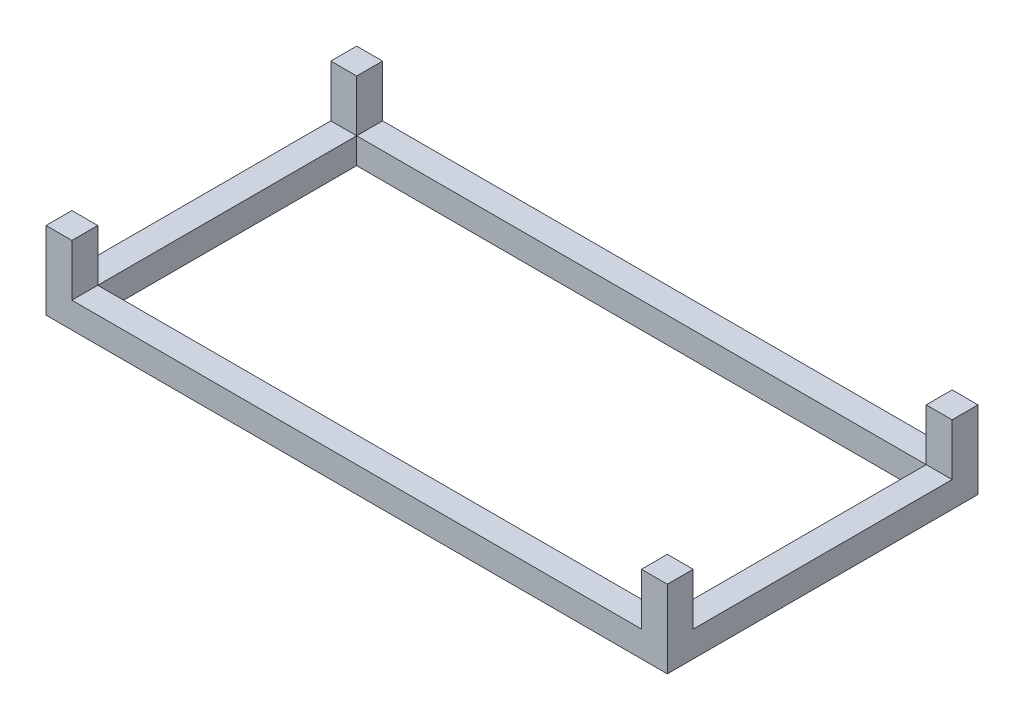
ISO-10303-21;
HEADER;
FILE_DESCRIPTION(('STEP AP214'),'2;1');
FILE_NAME('part.step','',(''),(''),'','','');
FILE_SCHEMA(('AUTOMOTIVE_DESIGN { 1 0 10303 214 1 1 1 1 }'));
ENDSEC;
DATA;
#1=APPLICATION_CONTEXT('core data for automotive mechanical design processes');
#2=APPLICATION_PROTOCOL_DEFINITION('international standard','automotive_design',2000,#1);
#3=PRODUCT_CONTEXT('',#1,'mechanical');
#4=PRODUCT('Part','Part','',(#3));
#5=PRODUCT_RELATED_PRODUCT_CATEGORY('part','',(#4));
#6=PRODUCT_DEFINITION_FORMATION('','',#4);
#7=PRODUCT_DEFINITION_CONTEXT('part definition',#1,'design');
#8=PRODUCT_DEFINITION('design','',#6,#7);
#9=PRODUCT_DEFINITION_SHAPE('','',#8);
#10=(LENGTH_UNIT() NAMED_UNIT(*) SI_UNIT(.MILLI.,.METRE.));
#11=(NAMED_UNIT(*) PLANE_ANGLE_UNIT() SI_UNIT($,.RADIAN.));
#12=(NAMED_UNIT(*) SI_UNIT($,.STERADIAN.) SOLID_ANGLE_UNIT());
#13=UNCERTAINTY_MEASURE_WITH_UNIT(LENGTH_MEASURE(1.E-05),#10,'distance_accuracy_value','');
#14=(GEOMETRIC_REPRESENTATION_CONTEXT(3) GLOBAL_UNCERTAINTY_ASSIGNED_CONTEXT((#13)) GLOBAL_UNIT_ASSIGNED_CONTEXT((#10,
#11,#12)) REPRESENTATION_CONTEXT('',''));
#15=CARTESIAN_POINT('',(0.,0.,0.));
#16=DIRECTION('',(0.,0.,1.));
#17=DIRECTION('',(1.,0.,0.));
#18=AXIS2_PLACEMENT_3D('',#15,#16,#17);
#19=CARTESIAN_POINT('',(0.,0.,0.));
#20=DIRECTION('',(0.,1.,0.));
#21=DIRECTION('',(0.,0.,1.));
#22=AXIS2_PLACEMENT_3D('',#19,#20,#21);
#23=PLANE('',#22);
#24=DIRECTION('',(1.,0.,0.));
#25=VECTOR('',#24,1.);
#26=CARTESIAN_POINT('',(-69.85,0.,-31.75));
#27=LINE('',#26,#25);
#28=CARTESIAN_POINT('',(-69.85,0.,-31.75));
#29=VERTEX_POINT('',#28);
#30=CARTESIAN_POINT('',(69.85,0.,-31.75));
#31=VERTEX_POINT('',#30);
#32=EDGE_CURVE('E266',#29,#31,#27,.T.);
#33=ORIENTED_EDGE('',*,*,#32,.T.);
#34=DIRECTION('',(0.,0.,1.));
#35=VECTOR('',#34,1.);
#36=CARTESIAN_POINT('',(69.85,0.,-31.75));
#37=LINE('',#36,#35);
#38=CARTESIAN_POINT('',(69.85,0.,-38.1));
#39=VERTEX_POINT('',#38);
#40=EDGE_CURVE('E50',#39,#31,#37,.T.);
#41=ORIENTED_EDGE('',*,*,#40,.F.);
#42=DIRECTION('',(-1.,0.,0.));
#43=VECTOR('',#42,1.);
#44=CARTESIAN_POINT('',(-76.2,0.,-38.1));
#45=LINE('',#44,#43);
#46=CARTESIAN_POINT('',(-69.85,0.,-38.1));
#47=VERTEX_POINT('',#46);
#48=EDGE_CURVE('E298',#39,#47,#45,.T.);
#49=ORIENTED_EDGE('',*,*,#48,.T.);
#50=DIRECTION('',(0.,0.,-1.));
#51=VECTOR('',#50,1.);
#52=CARTESIAN_POINT('',(-69.85,0.,-38.1));
#53=LINE('',#52,#51);
#54=EDGE_CURVE('E243',#29,#47,#53,.T.);
#55=ORIENTED_EDGE('',*,*,#54,.F.);
#56=EDGE_LOOP('',(#33,#41,#49,#55));
#57=FACE_BOUND('',#56,.T.);
#58=ADVANCED_FACE('F33',(#57),#23,.T.);
#59=DIRECTION('',(0.,0.,-1.));
#60=VECTOR('',#59,1.);
#61=CARTESIAN_POINT('',(76.2,0.,-38.1));
#62=LINE('',#61,#60);
#63=CARTESIAN_POINT('',(76.2,0.,31.75));
#64=VERTEX_POINT('',#63);
#65=CARTESIAN_POINT('',(76.2,0.,-31.75));
#66=VERTEX_POINT('',#65);
#67=EDGE_CURVE('E58',#64,#66,#62,.T.);
#68=ORIENTED_EDGE('',*,*,#67,.T.);
#69=DIRECTION('',(1.,0.,0.));
#70=VECTOR('',#69,1.);
#71=CARTESIAN_POINT('',(69.85,0.,-31.75));
#72=LINE('',#71,#70);
#73=EDGE_CURVE('E180',#31,#66,#72,.T.);
#74=ORIENTED_EDGE('',*,*,#73,.F.);
#75=DIRECTION('',(0.,0.,1.));
#76=VECTOR('',#75,1.);
#77=CARTESIAN_POINT('',(69.85,0.,31.75));
#78=LINE('',#77,#76);
#79=CARTESIAN_POINT('',(69.85,0.,31.75));
#80=VERTEX_POINT('',#79);
#81=EDGE_CURVE('E269',#31,#80,#78,.T.);
#82=ORIENTED_EDGE('',*,*,#81,.T.);
#83=DIRECTION('',(-1.,0.,0.));
#84=VECTOR('',#83,1.);
#85=CARTESIAN_POINT('',(69.85,0.,31.75));
#86=LINE('',#85,#84);
#87=EDGE_CURVE('E186',#64,#80,#86,.T.);
#88=ORIENTED_EDGE('',*,*,#87,.F.);
#89=EDGE_LOOP('',(#68,#74,#82,#88));
#90=FACE_BOUND('',#89,.T.);
#91=ADVANCED_FACE('F374',(#90),#23,.T.);
#92=DIRECTION('',(1.,0.,0.));
#93=VECTOR('',#92,1.);
#94=CARTESIAN_POINT('',(-76.2,0.,38.1));
#95=LINE('',#94,#93);
#96=CARTESIAN_POINT('',(-69.85,0.,38.1));
#97=VERTEX_POINT('',#96);
#98=CARTESIAN_POINT('',(69.8499999999999,0.,38.1));
#99=VERTEX_POINT('',#98);
#100=EDGE_CURVE('E308',#97,#99,#95,.T.);
#101=ORIENTED_EDGE('',*,*,#100,.T.);
#102=DIRECTION('',(0.,0.,1.));
#103=VECTOR('',#102,1.);
#104=CARTESIAN_POINT('',(69.85,0.,31.75));
#105=LINE('',#104,#103);
#106=EDGE_CURVE('E183',#80,#99,#105,.T.);
#107=ORIENTED_EDGE('',*,*,#106,.F.);
#108=DIRECTION('',(-1.,0.,0.));
#109=VECTOR('',#108,1.);
#110=CARTESIAN_POINT('',(-69.85,0.,31.75));
#111=LINE('',#110,#109);
#112=CARTESIAN_POINT('',(-69.85,0.,31.75));
#113=VERTEX_POINT('',#112);
#114=EDGE_CURVE('E272',#80,#113,#111,.T.);
#115=ORIENTED_EDGE('',*,*,#114,.T.);
#116=DIRECTION('',(0.,0.,-1.));
#117=VECTOR('',#116,1.);
#118=CARTESIAN_POINT('',(-69.85,0.,31.75));
#119=LINE('',#118,#117);
#120=EDGE_CURVE('E213',#97,#113,#119,.T.);
#121=ORIENTED_EDGE('',*,*,#120,.F.);
#122=EDGE_LOOP('',(#101,#107,#115,#121));
#123=FACE_BOUND('',#122,.T.);
#124=ADVANCED_FACE('F362',(#123),#23,.T.);
#125=DIRECTION('',(0.,0.,1.));
#126=VECTOR('',#125,1.);
#127=CARTESIAN_POINT('',(-76.2,0.,-38.1));
#128=LINE('',#127,#126);
#129=CARTESIAN_POINT('',(-76.2,0.,-31.75));
#130=VERTEX_POINT('',#129);
#131=CARTESIAN_POINT('',(-76.2,0.,31.75));
#132=VERTEX_POINT('',#131);
#133=EDGE_CURVE('E287',#130,#132,#128,.T.);
#134=ORIENTED_EDGE('',*,*,#133,.T.);
#135=DIRECTION('',(-1.,0.,0.));
#136=VECTOR('',#135,1.);
#137=CARTESIAN_POINT('',(-69.85,0.,31.75));
#138=LINE('',#137,#136);
#139=EDGE_CURVE('E218',#113,#132,#138,.T.);
#140=ORIENTED_EDGE('',*,*,#139,.F.);
#141=DIRECTION('',(0.,0.,-1.));
#142=VECTOR('',#141,1.);
#143=CARTESIAN_POINT('',(-69.85,0.,31.75));
#144=LINE('',#143,#142);
#145=EDGE_CURVE('E264',#113,#29,#144,.T.);
#146=ORIENTED_EDGE('',*,*,#145,.T.);
#147=DIRECTION('',(1.,0.,0.));
#148=VECTOR('',#147,1.);
#149=CARTESIAN_POINT('',(-76.2,0.,-31.75));
#150=LINE('',#149,#148);
#151=EDGE_CURVE('E238',#130,#29,#150,.T.);
#152=ORIENTED_EDGE('',*,*,#151,.F.);
#153=EDGE_LOOP('',(#134,#140,#146,#152));
#154=FACE_BOUND('',#153,.T.);
#155=ADVANCED_FACE('F390',(#154),#23,.T.);
#156=CARTESIAN_POINT('',(-76.2,-6.35,-38.1));
#157=DIRECTION('',(-1.,0.,0.));
#158=DIRECTION('',(0.,0.,1.));
#159=AXIS2_PLACEMENT_3D('',#156,#157,#158);
#160=PLANE('',#159);
#161=ORIENTED_EDGE('',*,*,#133,.F.);
#162=DIRECTION('',(0.,-1.,0.));
#163=VECTOR('',#162,1.);
#164=CARTESIAN_POINT('',(-76.2,12.7,-31.75));
#165=LINE('',#164,#163);
#166=CARTESIAN_POINT('',(-76.2,12.7,-31.75));
#167=VERTEX_POINT('',#166);
#168=EDGE_CURVE('E260',#167,#130,#165,.T.);
#169=ORIENTED_EDGE('',*,*,#168,.F.);
#170=DIRECTION('',(0.,0.,1.));
#171=VECTOR('',#170,1.);
#172=CARTESIAN_POINT('',(-76.2,12.7,-38.1));
#173=LINE('',#172,#171);
#174=CARTESIAN_POINT('',(-76.2,12.7,-38.1));
#175=VERTEX_POINT('',#174);
#176=EDGE_CURVE('E239',#175,#167,#173,.T.);
#177=ORIENTED_EDGE('',*,*,#176,.F.);
#178=DIRECTION('',(0.,1.,0.));
#179=VECTOR('',#178,1.);
#180=CARTESIAN_POINT('',(-76.2,-6.35,-38.1));
#181=LINE('',#180,#179);
#182=CARTESIAN_POINT('',(-76.2,-6.35,-38.1));
#183=VERTEX_POINT('',#182);
#184=EDGE_CURVE('E11',#183,#175,#181,.T.);
#185=ORIENTED_EDGE('',*,*,#184,.F.);
#186=DIRECTION('',(0.,0.,1.));
#187=VECTOR('',#186,1.);
#188=CARTESIAN_POINT('',(-76.2,-6.35,-38.1));
#189=LINE('',#188,#187);
#190=CARTESIAN_POINT('',(-76.2,-6.35,38.1));
#191=VERTEX_POINT('',#190);
#192=EDGE_CURVE('E294',#183,#191,#189,.T.);
#193=ORIENTED_EDGE('',*,*,#192,.T.);
#194=DIRECTION('',(0.,1.,0.));
#195=VECTOR('',#194,1.);
#196=CARTESIAN_POINT('',(-76.2,-6.35,38.1));
#197=LINE('',#196,#195);
#198=CARTESIAN_POINT('',(-76.2,12.7,38.1));
#199=VERTEX_POINT('',#198);
#200=EDGE_CURVE('E37',#191,#199,#197,.T.);
#201=ORIENTED_EDGE('',*,*,#200,.T.);
#202=DIRECTION('',(0.,0.,1.));
#203=VECTOR('',#202,1.);
#204=CARTESIAN_POINT('',(-76.2,12.7,31.75));
#205=LINE('',#204,#203);
#206=CARTESIAN_POINT('',(-76.2,12.7,31.75));
#207=VERTEX_POINT('',#206);
#208=EDGE_CURVE('E220',#207,#199,#205,.T.);
#209=ORIENTED_EDGE('',*,*,#208,.F.);
#210=DIRECTION('',(0.,-1.,0.));
#211=VECTOR('',#210,1.);
#212=CARTESIAN_POINT('',(-76.2,12.7,31.75));
#213=LINE('',#212,#211);
#214=EDGE_CURVE('E232',#207,#132,#213,.T.);
#215=ORIENTED_EDGE('',*,*,#214,.T.);
#216=EDGE_LOOP('',(#161,#169,#177,#185,#193,#201,#209,#215));
#217=FACE_BOUND('',#216,.T.);
#218=ADVANCED_FACE('F35',(#217),#160,.T.);
#219=CARTESIAN_POINT('',(-76.2,-6.35,-38.1));
#220=DIRECTION('',(0.,0.,-1.));
#221=DIRECTION('',(-1.,0.,0.));
#222=AXIS2_PLACEMENT_3D('',#219,#220,#221);
#223=PLANE('',#222);
#224=ORIENTED_EDGE('',*,*,#48,.F.);
#225=DIRECTION('',(0.,-1.,0.));
#226=VECTOR('',#225,1.);
#227=CARTESIAN_POINT('',(69.85,12.7,-38.1));
#228=LINE('',#227,#226);
#229=CARTESIAN_POINT('',(69.85,12.7,-38.1));
#230=VERTEX_POINT('',#229);
#231=EDGE_CURVE('E188',#230,#39,#228,.T.);
#232=ORIENTED_EDGE('',*,*,#231,.F.);
#233=DIRECTION('',(-1.,0.,0.));
#234=VECTOR('',#233,1.);
#235=CARTESIAN_POINT('',(69.85,12.7,-38.1));
#236=LINE('',#235,#234);
#237=CARTESIAN_POINT('',(76.2,12.7,-38.1));
#238=VERTEX_POINT('',#237);
#239=EDGE_CURVE('E176',#238,#230,#236,.T.);
#240=ORIENTED_EDGE('',*,*,#239,.F.);
#241=DIRECTION('',(0.,1.,0.));
#242=VECTOR('',#241,1.);
#243=CARTESIAN_POINT('',(76.2,-6.35,-38.1));
#244=LINE('',#243,#242);
#245=CARTESIAN_POINT('',(76.2,-6.35,-38.1));
#246=VERTEX_POINT('',#245);
#247=EDGE_CURVE('E42',#246,#238,#244,.T.);
#248=ORIENTED_EDGE('',*,*,#247,.F.);
#249=DIRECTION('',(-1.,0.,0.));
#250=VECTOR('',#249,1.);
#251=CARTESIAN_POINT('',(-76.2,-6.35,-38.1));
#252=LINE('',#251,#250);
#253=EDGE_CURVE('E304',#246,#183,#252,.T.);
#254=ORIENTED_EDGE('',*,*,#253,.T.);
#255=ORIENTED_EDGE('',*,*,#184,.T.);
#256=DIRECTION('',(-1.,0.,0.));
#257=VECTOR('',#256,1.);
#258=CARTESIAN_POINT('',(-76.2,12.7,-38.1));
#259=LINE('',#258,#257);
#260=CARTESIAN_POINT('',(-69.85,12.7,-38.1));
#261=VERTEX_POINT('',#260);
#262=EDGE_CURVE('E247',#261,#175,#259,.T.);
#263=ORIENTED_EDGE('',*,*,#262,.F.);
#264=DIRECTION('',(0.,-1.,0.));
#265=VECTOR('',#264,1.);
#266=CARTESIAN_POINT('',(-69.85,12.7,-38.1));
#267=LINE('',#266,#265);
#268=EDGE_CURVE('E250',#261,#47,#267,.T.);
#269=ORIENTED_EDGE('',*,*,#268,.T.);
#270=EDGE_LOOP('',(#224,#232,#240,#248,#254,#255,#263,#269));
#271=FACE_BOUND('',#270,.T.);
#272=ADVANCED_FACE('F347',(#271),#223,.T.);
#273=CARTESIAN_POINT('',(76.2,-6.35,-38.1));
#274=DIRECTION('',(1.,0.,0.));
#275=DIRECTION('',(0.,0.,-1.));
#276=AXIS2_PLACEMENT_3D('',#273,#274,#275);
#277=PLANE('',#276);
#278=ORIENTED_EDGE('',*,*,#67,.F.);
#279=DIRECTION('',(0.,-1.,0.));
#280=VECTOR('',#279,1.);
#281=CARTESIAN_POINT('',(76.2,12.7,31.75));
#282=LINE('',#281,#280);
#283=CARTESIAN_POINT('',(76.2,12.7,31.75));
#284=VERTEX_POINT('',#283);
#285=EDGE_CURVE('E207',#284,#64,#282,.T.);
#286=ORIENTED_EDGE('',*,*,#285,.F.);
#287=DIRECTION('',(0.,0.,-1.));
#288=VECTOR('',#287,1.);
#289=CARTESIAN_POINT('',(76.2,12.7,31.75));
#290=LINE('',#289,#288);
#291=CARTESIAN_POINT('',(76.2,12.7,38.1));
#292=VERTEX_POINT('',#291);
#293=EDGE_CURVE('E198',#292,#284,#290,.T.);
#294=ORIENTED_EDGE('',*,*,#293,.F.);
#295=DIRECTION('',(0.,1.,0.));
#296=VECTOR('',#295,1.);
#297=CARTESIAN_POINT('',(76.2,-6.35,38.1));
#298=LINE('',#297,#296);
#299=CARTESIAN_POINT('',(76.2,-6.35,38.1));
#300=VERTEX_POINT('',#299);
#301=EDGE_CURVE('E312',#300,#292,#298,.T.);
#302=ORIENTED_EDGE('',*,*,#301,.F.);
#303=DIRECTION('',(0.,0.,-1.));
#304=VECTOR('',#303,1.);
#305=CARTESIAN_POINT('',(76.2,-6.35,-38.1));
#306=LINE('',#305,#304);
#307=EDGE_CURVE('E301',#300,#246,#306,.T.);
#308=ORIENTED_EDGE('',*,*,#307,.T.);
#309=ORIENTED_EDGE('',*,*,#247,.T.);
#310=DIRECTION('',(0.,0.,-1.));
#311=VECTOR('',#310,1.);
#312=CARTESIAN_POINT('',(76.2,12.7,-31.75));
#313=LINE('',#312,#311);
#314=CARTESIAN_POINT('',(76.2,12.7,-31.75));
#315=VERTEX_POINT('',#314);
#316=EDGE_CURVE('E170',#315,#238,#313,.T.);
#317=ORIENTED_EDGE('',*,*,#316,.F.);
#318=DIRECTION('',(0.,-1.,0.));
#319=VECTOR('',#318,1.);
#320=CARTESIAN_POINT('',(76.2,12.7,-31.75));
#321=LINE('',#320,#319);
#322=EDGE_CURVE('E166',#315,#66,#321,.T.);
#323=ORIENTED_EDGE('',*,*,#322,.T.);
#324=EDGE_LOOP('',(#278,#286,#294,#302,#308,#309,#317,#323));
#325=FACE_BOUND('',#324,.T.);
#326=ADVANCED_FACE('F349',(#325),#277,.T.);
#327=CARTESIAN_POINT('',(-76.2,-6.35,38.1));
#328=DIRECTION('',(0.,0.,1.));
#329=DIRECTION('',(1.,0.,0.));
#330=AXIS2_PLACEMENT_3D('',#327,#328,#329);
#331=PLANE('',#330);
#332=ORIENTED_EDGE('',*,*,#100,.F.);
#333=DIRECTION('',(0.,-1.,0.));
#334=VECTOR('',#333,1.);
#335=CARTESIAN_POINT('',(-69.85,12.7,38.1));
#336=LINE('',#335,#334);
#337=CARTESIAN_POINT('',(-69.85,12.7,38.1));
#338=VERTEX_POINT('',#337);
#339=EDGE_CURVE('E225',#338,#97,#336,.T.);
#340=ORIENTED_EDGE('',*,*,#339,.F.);
#341=DIRECTION('',(1.,0.,0.));
#342=VECTOR('',#341,1.);
#343=CARTESIAN_POINT('',(-69.85,12.7,38.1));
#344=LINE('',#343,#342);
#345=EDGE_CURVE('E223',#199,#338,#344,.T.);
#346=ORIENTED_EDGE('',*,*,#345,.F.);
#347=ORIENTED_EDGE('',*,*,#200,.F.);
#348=DIRECTION('',(1.,0.,0.));
#349=VECTOR('',#348,1.);
#350=CARTESIAN_POINT('',(-76.2,-6.35,38.1));
#351=LINE('',#350,#349);
#352=EDGE_CURVE('E297',#191,#300,#351,.T.);
#353=ORIENTED_EDGE('',*,*,#352,.T.);
#354=ORIENTED_EDGE('',*,*,#301,.T.);
#355=DIRECTION('',(1.,0.,0.));
#356=VECTOR('',#355,1.);
#357=CARTESIAN_POINT('',(69.85,12.7,38.1));
#358=LINE('',#357,#356);
#359=CARTESIAN_POINT('',(69.85,12.7,38.1));
#360=VERTEX_POINT('',#359);
#361=EDGE_CURVE('E195',#360,#292,#358,.T.);
#362=ORIENTED_EDGE('',*,*,#361,.F.);
#363=DIRECTION('',(0.,-1.,0.));
#364=VECTOR('',#363,1.);
#365=CARTESIAN_POINT('',(69.85,12.7,38.1));
#366=LINE('',#365,#364);
#367=EDGE_CURVE('E210',#360,#99,#366,.T.);
#368=ORIENTED_EDGE('',*,*,#367,.T.);
#369=EDGE_LOOP('',(#332,#340,#346,#347,#353,#354,#362,#368));
#370=FACE_BOUND('',#369,.T.);
#371=ADVANCED_FACE('F324',(#370),#331,.T.);
#372=CARTESIAN_POINT('',(0.,-6.35,0.));
#373=DIRECTION('',(0.,1.,0.));
#374=DIRECTION('',(0.,0.,1.));
#375=AXIS2_PLACEMENT_3D('',#372,#373,#374);
#376=PLANE('',#375);
#377=DIRECTION('',(1.,0.,0.));
#378=VECTOR('',#377,1.);
#379=CARTESIAN_POINT('',(-69.85,-6.35,-31.75));
#380=LINE('',#379,#378);
#381=CARTESIAN_POINT('',(-69.85,-6.35,-31.75));
#382=VERTEX_POINT('',#381);
#383=CARTESIAN_POINT('',(69.85,-6.35,-31.75));
#384=VERTEX_POINT('',#383);
#385=EDGE_CURVE('E277',#382,#384,#380,.T.);
#386=ORIENTED_EDGE('',*,*,#385,.F.);
#387=DIRECTION('',(0.,0.,-1.));
#388=VECTOR('',#387,1.);
#389=CARTESIAN_POINT('',(-69.85,-6.35,31.75));
#390=LINE('',#389,#388);
#391=CARTESIAN_POINT('',(-69.85,-6.35,31.75));
#392=VERTEX_POINT('',#391);
#393=EDGE_CURVE('E263',#392,#382,#390,.T.);
#394=ORIENTED_EDGE('',*,*,#393,.F.);
#395=DIRECTION('',(-1.,0.,0.));
#396=VECTOR('',#395,1.);
#397=CARTESIAN_POINT('',(-69.85,-6.35,31.75));
#398=LINE('',#397,#396);
#399=CARTESIAN_POINT('',(69.85,-6.35,31.75));
#400=VERTEX_POINT('',#399);
#401=EDGE_CURVE('E267',#400,#392,#398,.T.);
#402=ORIENTED_EDGE('',*,*,#401,.F.);
#403=DIRECTION('',(0.,0.,1.));
#404=VECTOR('',#403,1.);
#405=CARTESIAN_POINT('',(69.85,-6.35,31.75));
#406=LINE('',#405,#404);
#407=EDGE_CURVE('E280',#384,#400,#406,.T.);
#408=ORIENTED_EDGE('',*,*,#407,.F.);
#409=EDGE_LOOP('',(#386,#394,#402,#408));
#410=FACE_BOUND('',#409,.T.);
#411=ORIENTED_EDGE('',*,*,#192,.F.);
#412=ORIENTED_EDGE('',*,*,#253,.F.);
#413=ORIENTED_EDGE('',*,*,#307,.F.);
#414=ORIENTED_EDGE('',*,*,#352,.F.);
#415=EDGE_LOOP('',(#411,#412,#413,#414));
#416=FACE_BOUND('',#415,.T.);
#417=ADVANCED_FACE('F345',(#410,#416),#376,.F.);
#418=CARTESIAN_POINT('',(-69.85,0.,31.75));
#419=DIRECTION('',(-1.,0.,0.));
#420=DIRECTION('',(0.,0.,1.));
#421=AXIS2_PLACEMENT_3D('',#418,#419,#420);
#422=PLANE('',#421);
#423=ORIENTED_EDGE('',*,*,#393,.T.);
#424=DIRECTION('',(0.,-1.,0.));
#425=VECTOR('',#424,1.);
#426=CARTESIAN_POINT('',(-69.85,0.,-31.75));
#427=LINE('',#426,#425);
#428=EDGE_CURVE('E275',#29,#382,#427,.T.);
#429=ORIENTED_EDGE('',*,*,#428,.F.);
#430=ORIENTED_EDGE('',*,*,#145,.F.);
#431=DIRECTION('',(0.,-1.,0.));
#432=VECTOR('',#431,1.);
#433=CARTESIAN_POINT('',(-69.85,0.,31.75));
#434=LINE('',#433,#432);
#435=EDGE_CURVE('E285',#113,#392,#434,.T.);
#436=ORIENTED_EDGE('',*,*,#435,.T.);
#437=EDGE_LOOP('',(#423,#429,#430,#436));
#438=FACE_BOUND('',#437,.T.);
#439=ADVANCED_FACE('F411',(#438),#422,.F.);
#440=CARTESIAN_POINT('',(-69.85,0.,31.75));
#441=DIRECTION('',(0.,0.,1.));
#442=DIRECTION('',(1.,0.,0.));
#443=AXIS2_PLACEMENT_3D('',#440,#441,#442);
#444=PLANE('',#443);
#445=ORIENTED_EDGE('',*,*,#401,.T.);
#446=ORIENTED_EDGE('',*,*,#435,.F.);
#447=ORIENTED_EDGE('',*,*,#114,.F.);
#448=DIRECTION('',(0.,-1.,0.));
#449=VECTOR('',#448,1.);
#450=CARTESIAN_POINT('',(69.85,0.,31.75));
#451=LINE('',#450,#449);
#452=EDGE_CURVE('E288',#80,#400,#451,.T.);
#453=ORIENTED_EDGE('',*,*,#452,.T.);
#454=EDGE_LOOP('',(#445,#446,#447,#453));
#455=FACE_BOUND('',#454,.T.);
#456=ADVANCED_FACE('F372',(#455),#444,.F.);
#457=CARTESIAN_POINT('',(69.85,0.,31.75));
#458=DIRECTION('',(1.,0.,0.));
#459=DIRECTION('',(0.,0.,-1.));
#460=AXIS2_PLACEMENT_3D('',#457,#458,#459);
#461=PLANE('',#460);
#462=ORIENTED_EDGE('',*,*,#407,.T.);
#463=ORIENTED_EDGE('',*,*,#452,.F.);
#464=ORIENTED_EDGE('',*,*,#81,.F.);
#465=DIRECTION('',(0.,-1.,0.));
#466=VECTOR('',#465,1.);
#467=CARTESIAN_POINT('',(69.85,0.,-31.75));
#468=LINE('',#467,#466);
#469=EDGE_CURVE('E290',#31,#384,#468,.T.);
#470=ORIENTED_EDGE('',*,*,#469,.T.);
#471=EDGE_LOOP('',(#462,#463,#464,#470));
#472=FACE_BOUND('',#471,.T.);
#473=ADVANCED_FACE('F366',(#472),#461,.F.);
#474=CARTESIAN_POINT('',(-69.85,0.,-31.75));
#475=DIRECTION('',(0.,0.,-1.));
#476=DIRECTION('',(-1.,0.,0.));
#477=AXIS2_PLACEMENT_3D('',#474,#475,#476);
#478=PLANE('',#477);
#479=ORIENTED_EDGE('',*,*,#385,.T.);
#480=ORIENTED_EDGE('',*,*,#469,.F.);
#481=ORIENTED_EDGE('',*,*,#32,.F.);
#482=ORIENTED_EDGE('',*,*,#428,.T.);
#483=EDGE_LOOP('',(#479,#480,#481,#482));
#484=FACE_BOUND('',#483,.T.);
#485=ADVANCED_FACE('F420',(#484),#478,.F.);
#486=CARTESIAN_POINT('',(-76.2,12.7,-31.75));
#487=DIRECTION('',(0.,0.,-1.));
#488=DIRECTION('',(-1.,0.,0.));
#489=AXIS2_PLACEMENT_3D('',#486,#487,#488);
#490=PLANE('',#489);
#491=ORIENTED_EDGE('',*,*,#151,.T.);
#492=DIRECTION('',(0.,-1.,0.));
#493=VECTOR('',#492,1.);
#494=CARTESIAN_POINT('',(-69.85,12.7,-31.75));
#495=LINE('',#494,#493);
#496=CARTESIAN_POINT('',(-69.85,12.7,-31.75));
#497=VERTEX_POINT('',#496);
#498=EDGE_CURVE('E257',#497,#29,#495,.T.);
#499=ORIENTED_EDGE('',*,*,#498,.F.);
#500=DIRECTION('',(1.,0.,0.));
#501=VECTOR('',#500,1.);
#502=CARTESIAN_POINT('',(-76.2,12.7,-31.75));
#503=LINE('',#502,#501);
#504=EDGE_CURVE('E242',#167,#497,#503,.T.);
#505=ORIENTED_EDGE('',*,*,#504,.F.);
#506=ORIENTED_EDGE('',*,*,#168,.T.);
#507=EDGE_LOOP('',(#491,#499,#505,#506));
#508=FACE_BOUND('',#507,.T.);
#509=ADVANCED_FACE('F336',(#508),#490,.F.);
#510=CARTESIAN_POINT('',(-69.85,12.7,-38.1));
#511=DIRECTION('',(-1.,0.,0.));
#512=DIRECTION('',(0.,0.,1.));
#513=AXIS2_PLACEMENT_3D('',#510,#511,#512);
#514=PLANE('',#513);
#515=ORIENTED_EDGE('',*,*,#54,.T.);
#516=ORIENTED_EDGE('',*,*,#268,.F.);
#517=DIRECTION('',(0.,0.,-1.));
#518=VECTOR('',#517,1.);
#519=CARTESIAN_POINT('',(-69.85,12.7,-38.1));
#520=LINE('',#519,#518);
#521=EDGE_CURVE('E245',#497,#261,#520,.T.);
#522=ORIENTED_EDGE('',*,*,#521,.F.);
#523=ORIENTED_EDGE('',*,*,#498,.T.);
#524=EDGE_LOOP('',(#515,#516,#522,#523));
#525=FACE_BOUND('',#524,.T.);
#526=ADVANCED_FACE('F430',(#525),#514,.F.);
#527=CARTESIAN_POINT('',(0.,12.7,0.));
#528=DIRECTION('',(0.,1.,0.));
#529=DIRECTION('',(0.,0.,1.));
#530=AXIS2_PLACEMENT_3D('',#527,#528,#529);
#531=PLANE('',#530);
#532=ORIENTED_EDGE('',*,*,#176,.T.);
#533=ORIENTED_EDGE('',*,*,#504,.T.);
#534=ORIENTED_EDGE('',*,*,#521,.T.);
#535=ORIENTED_EDGE('',*,*,#262,.T.);
#536=EDGE_LOOP('',(#532,#533,#534,#535));
#537=FACE_BOUND('',#536,.T.);
#538=ADVANCED_FACE('F340',(#537),#531,.T.);
#539=CARTESIAN_POINT('',(-69.85,12.7,31.75));
#540=DIRECTION('',(-1.,0.,0.));
#541=DIRECTION('',(0.,0.,1.));
#542=AXIS2_PLACEMENT_3D('',#539,#540,#541);
#543=PLANE('',#542);
#544=ORIENTED_EDGE('',*,*,#120,.T.);
#545=DIRECTION('',(0.,-1.,0.));
#546=VECTOR('',#545,1.);
#547=CARTESIAN_POINT('',(-69.85,12.7,31.75));
#548=LINE('',#547,#546);
#549=CARTESIAN_POINT('',(-69.85,12.7,31.75));
#550=VERTEX_POINT('',#549);
#551=EDGE_CURVE('E235',#550,#113,#548,.T.);
#552=ORIENTED_EDGE('',*,*,#551,.F.);
#553=DIRECTION('',(0.,0.,-1.));
#554=VECTOR('',#553,1.);
#555=CARTESIAN_POINT('',(-69.85,12.7,31.75));
#556=LINE('',#555,#554);
#557=EDGE_CURVE('E214',#338,#550,#556,.T.);
#558=ORIENTED_EDGE('',*,*,#557,.F.);
#559=ORIENTED_EDGE('',*,*,#339,.T.);
#560=EDGE_LOOP('',(#544,#552,#558,#559));
#561=FACE_BOUND('',#560,.T.);
#562=ADVANCED_FACE('F329',(#561),#543,.F.);
#563=CARTESIAN_POINT('',(-69.85,12.7,31.75));
#564=DIRECTION('',(0.,0.,1.));
#565=DIRECTION('',(1.,0.,0.));
#566=AXIS2_PLACEMENT_3D('',#563,#564,#565);
#567=PLANE('',#566);
#568=ORIENTED_EDGE('',*,*,#139,.T.);
#569=ORIENTED_EDGE('',*,*,#214,.F.);
#570=DIRECTION('',(-1.,0.,0.));
#571=VECTOR('',#570,1.);
#572=CARTESIAN_POINT('',(-69.85,12.7,31.75));
#573=LINE('',#572,#571);
#574=EDGE_CURVE('E217',#550,#207,#573,.T.);
#575=ORIENTED_EDGE('',*,*,#574,.F.);
#576=ORIENTED_EDGE('',*,*,#551,.T.);
#577=EDGE_LOOP('',(#568,#569,#575,#576));
#578=FACE_BOUND('',#577,.T.);
#579=ADVANCED_FACE('F331',(#578),#567,.F.);
#580=CARTESIAN_POINT('',(0.,12.7,0.));
#581=DIRECTION('',(0.,-1.,0.));
#582=DIRECTION('',(0.,0.,-1.));
#583=AXIS2_PLACEMENT_3D('',#580,#581,#582);
#584=PLANE('',#583);
#585=ORIENTED_EDGE('',*,*,#557,.T.);
#586=ORIENTED_EDGE('',*,*,#574,.T.);
#587=ORIENTED_EDGE('',*,*,#208,.T.);
#588=ORIENTED_EDGE('',*,*,#345,.T.);
#589=EDGE_LOOP('',(#585,#586,#587,#588));
#590=FACE_BOUND('',#589,.T.);
#591=ADVANCED_FACE('F321',(#590),#584,.F.);
#592=CARTESIAN_POINT('',(69.85,12.7,31.75));
#593=DIRECTION('',(1.,0.,0.));
#594=DIRECTION('',(0.,0.,-1.));
#595=AXIS2_PLACEMENT_3D('',#592,#593,#594);
#596=PLANE('',#595);
#597=ORIENTED_EDGE('',*,*,#106,.T.);
#598=ORIENTED_EDGE('',*,*,#367,.F.);
#599=DIRECTION('',(0.,0.,1.));
#600=VECTOR('',#599,1.);
#601=CARTESIAN_POINT('',(69.85,12.7,31.75));
#602=LINE('',#601,#600);
#603=CARTESIAN_POINT('',(69.85,12.7,31.75));
#604=VERTEX_POINT('',#603);
#605=EDGE_CURVE('E192',#604,#360,#602,.T.);
#606=ORIENTED_EDGE('',*,*,#605,.F.);
#607=DIRECTION('',(0.,-1.,0.));
#608=VECTOR('',#607,1.);
#609=CARTESIAN_POINT('',(69.85,12.7,31.75));
#610=LINE('',#609,#608);
#611=EDGE_CURVE('E201',#604,#80,#610,.T.);
#612=ORIENTED_EDGE('',*,*,#611,.T.);
#613=EDGE_LOOP('',(#597,#598,#606,#612));
#614=FACE_BOUND('',#613,.T.);
#615=ADVANCED_FACE('F359',(#614),#596,.F.);
#616=CARTESIAN_POINT('',(69.85,12.7,31.75));
#617=DIRECTION('',(0.,0.,1.));
#618=DIRECTION('',(1.,0.,0.));
#619=AXIS2_PLACEMENT_3D('',#616,#617,#618);
#620=PLANE('',#619);
#621=ORIENTED_EDGE('',*,*,#87,.T.);
#622=ORIENTED_EDGE('',*,*,#611,.F.);
#623=DIRECTION('',(-1.,0.,0.));
#624=VECTOR('',#623,1.);
#625=CARTESIAN_POINT('',(69.85,12.7,31.75));
#626=LINE('',#625,#624);
#627=EDGE_CURVE('E200',#284,#604,#626,.T.);
#628=ORIENTED_EDGE('',*,*,#627,.F.);
#629=ORIENTED_EDGE('',*,*,#285,.T.);
#630=EDGE_LOOP('',(#621,#622,#628,#629));
#631=FACE_BOUND('',#630,.T.);
#632=ADVANCED_FACE('F376',(#631),#620,.F.);
#633=CARTESIAN_POINT('',(0.,12.7,0.));
#634=DIRECTION('',(0.,1.,0.));
#635=DIRECTION('',(0.,0.,1.));
#636=AXIS2_PLACEMENT_3D('',#633,#634,#635);
#637=PLANE('',#636);
#638=ORIENTED_EDGE('',*,*,#605,.T.);
#639=ORIENTED_EDGE('',*,*,#361,.T.);
#640=ORIENTED_EDGE('',*,*,#293,.T.);
#641=ORIENTED_EDGE('',*,*,#627,.T.);
#642=EDGE_LOOP('',(#638,#639,#640,#641));
#643=FACE_BOUND('',#642,.T.);
#644=ADVANCED_FACE('F354',(#643),#637,.T.);
#645=CARTESIAN_POINT('',(69.85,12.7,-31.75));
#646=DIRECTION('',(1.,0.,0.));
#647=DIRECTION('',(0.,0.,-1.));
#648=AXIS2_PLACEMENT_3D('',#645,#646,#647);
#649=PLANE('',#648);
#650=ORIENTED_EDGE('',*,*,#40,.T.);
#651=DIRECTION('',(0.,-1.,0.));
#652=VECTOR('',#651,1.);
#653=CARTESIAN_POINT('',(69.85,12.7,-31.75));
#654=LINE('',#653,#652);
#655=CARTESIAN_POINT('',(69.85,12.7,-31.75));
#656=VERTEX_POINT('',#655);
#657=EDGE_CURVE('E164',#656,#31,#654,.T.);
#658=ORIENTED_EDGE('',*,*,#657,.F.);
#659=DIRECTION('',(0.,0.,1.));
#660=VECTOR('',#659,1.);
#661=CARTESIAN_POINT('',(69.85,12.7,-31.75));
#662=LINE('',#661,#660);
#663=EDGE_CURVE('E171',#230,#656,#662,.T.);
#664=ORIENTED_EDGE('',*,*,#663,.F.);
#665=ORIENTED_EDGE('',*,*,#231,.T.);
#666=EDGE_LOOP('',(#650,#658,#664,#665));
#667=FACE_BOUND('',#666,.T.);
#668=ADVANCED_FACE('F182',(#667),#649,.F.);
#669=CARTESIAN_POINT('',(69.85,12.7,-31.75));
#670=DIRECTION('',(0.,0.,-1.));
#671=DIRECTION('',(-1.,0.,0.));
#672=AXIS2_PLACEMENT_3D('',#669,#670,#671);
#673=PLANE('',#672);
#674=ORIENTED_EDGE('',*,*,#73,.T.);
#675=ORIENTED_EDGE('',*,*,#322,.F.);
#676=DIRECTION('',(1.,0.,0.));
#677=VECTOR('',#676,1.);
#678=CARTESIAN_POINT('',(69.85,12.7,-31.75));
#679=LINE('',#678,#677);
#680=EDGE_CURVE('E160',#656,#315,#679,.T.);
#681=ORIENTED_EDGE('',*,*,#680,.F.);
#682=ORIENTED_EDGE('',*,*,#657,.T.);
#683=EDGE_LOOP('',(#674,#675,#681,#682));
#684=FACE_BOUND('',#683,.T.);
#685=ADVANCED_FACE('F162',(#684),#673,.F.);
#686=CARTESIAN_POINT('',(0.,12.7,0.));
#687=DIRECTION('',(0.,-1.,0.));
#688=DIRECTION('',(0.,0.,-1.));
#689=AXIS2_PLACEMENT_3D('',#686,#687,#688);
#690=PLANE('',#689);
#691=ORIENTED_EDGE('',*,*,#663,.T.);
#692=ORIENTED_EDGE('',*,*,#680,.T.);
#693=ORIENTED_EDGE('',*,*,#316,.T.);
#694=ORIENTED_EDGE('',*,*,#239,.T.);
#695=EDGE_LOOP('',(#691,#692,#693,#694));
#696=FACE_BOUND('',#695,.T.);
#697=ADVANCED_FACE('F174',(#696),#690,.F.);
#698=CLOSED_SHELL('',(#58,#91,#124,#155,#218,#272,#326,#371,#417,#439,#456,#473,#485,#509,#526,
#538,#562,#579,#591,#615,#632,#644,#668,#685,#697));
#699=MANIFOLD_SOLID_BREP('B2',#698);
#700=ADVANCED_BREP_SHAPE_REPRESENTATION('',(#18,#699),#14);
#701=SHAPE_DEFINITION_REPRESENTATION(#9,#700);
ENDSEC;
END-ISO-10303-21;
